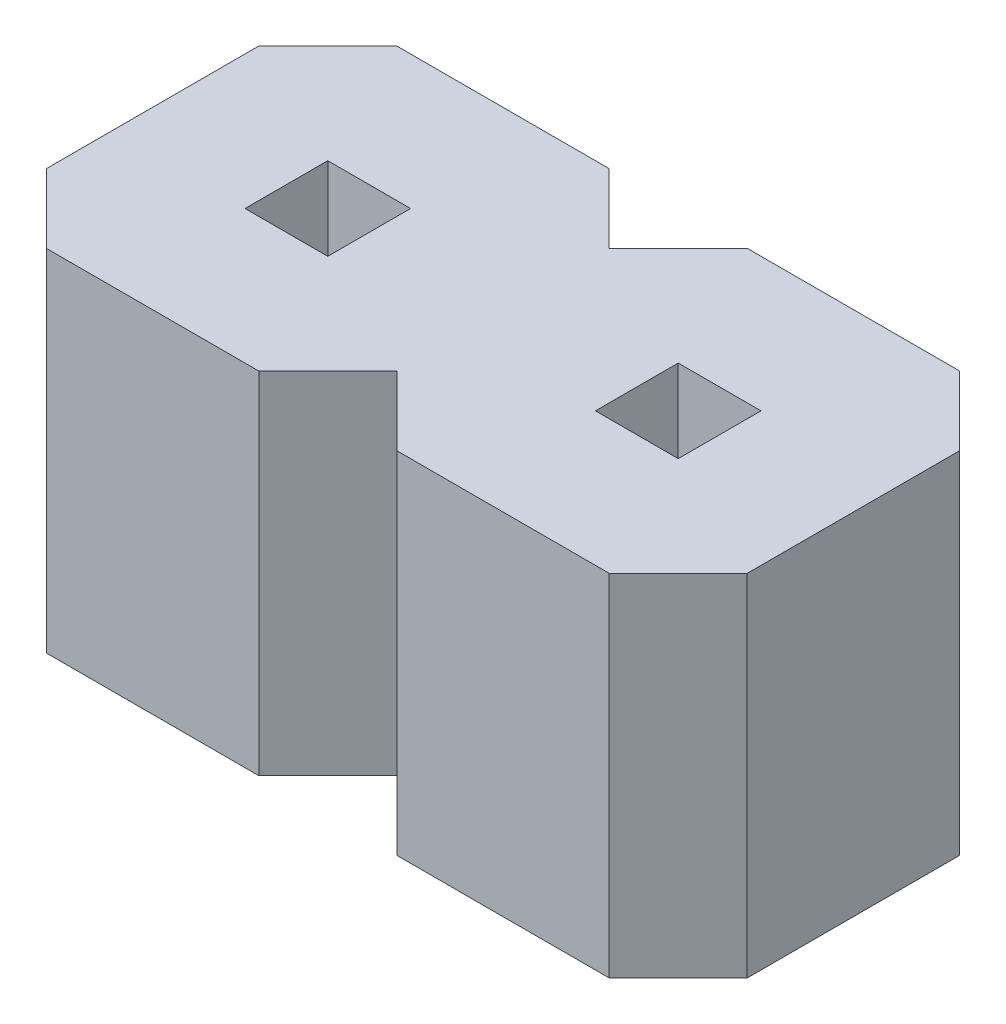
ISO-10303-21;
HEADER;
FILE_DESCRIPTION(('STEP AP214'),'2;1');
FILE_NAME('part.step','',(''),(''),'','','');
FILE_SCHEMA(('AUTOMOTIVE_DESIGN { 1 0 10303 214 1 1 1 1 }'));
ENDSEC;
DATA;
#1=APPLICATION_CONTEXT('core data for automotive mechanical design processes');
#2=APPLICATION_PROTOCOL_DEFINITION('international standard','automotive_design',2000,#1);
#3=PRODUCT_CONTEXT('',#1,'mechanical');
#4=PRODUCT('Part','Part','',(#3));
#5=PRODUCT_RELATED_PRODUCT_CATEGORY('part','',(#4));
#6=PRODUCT_DEFINITION_FORMATION('','',#4);
#7=PRODUCT_DEFINITION_CONTEXT('part definition',#1,'design');
#8=PRODUCT_DEFINITION('design','',#6,#7);
#9=PRODUCT_DEFINITION_SHAPE('','',#8);
#10=(LENGTH_UNIT() NAMED_UNIT(*) SI_UNIT(.MILLI.,.METRE.));
#11=(NAMED_UNIT(*) PLANE_ANGLE_UNIT() SI_UNIT($,.RADIAN.));
#12=(NAMED_UNIT(*) SI_UNIT($,.STERADIAN.) SOLID_ANGLE_UNIT());
#13=UNCERTAINTY_MEASURE_WITH_UNIT(LENGTH_MEASURE(1.E-05),#10,'distance_accuracy_value','');
#14=(GEOMETRIC_REPRESENTATION_CONTEXT(3) GLOBAL_UNCERTAINTY_ASSIGNED_CONTEXT((#13)) GLOBAL_UNIT_ASSIGNED_CONTEXT((#10,
#11,#12)) REPRESENTATION_CONTEXT('',''));
#15=CARTESIAN_POINT('',(0.,0.,0.));
#16=DIRECTION('',(0.,0.,1.));
#17=DIRECTION('',(1.,0.,0.));
#18=AXIS2_PLACEMENT_3D('',#15,#16,#17);
#19=CARTESIAN_POINT('',(0.,2.54,0.));
#20=DIRECTION('',(0.,-1.,0.));
#21=DIRECTION('',(0.,0.,-1.));
#22=AXIS2_PLACEMENT_3D('',#19,#20,#21);
#23=PLANE('',#22);
#24=DIRECTION('',(0.,0.,-1.));
#25=VECTOR('',#24,1.);
#26=CARTESIAN_POINT('',(-3.51,2.54,-0.97));
#27=LINE('',#26,#25);
#28=CARTESIAN_POINT('',(-3.51,2.54,-0.97));
#29=VERTEX_POINT('',#28);
#30=CARTESIAN_POINT('',(-3.51,2.54,-1.57));
#31=VERTEX_POINT('',#30);
#32=EDGE_CURVE('E221',#29,#31,#27,.T.);
#33=ORIENTED_EDGE('',*,*,#32,.F.);
#34=DIRECTION('',(1.,0.,0.));
#35=VECTOR('',#34,1.);
#36=CARTESIAN_POINT('',(-4.11,2.54,-0.97));
#37=LINE('',#36,#35);
#38=CARTESIAN_POINT('',(-4.11,2.54,-0.97));
#39=VERTEX_POINT('',#38);
#40=EDGE_CURVE('E229',#39,#29,#37,.T.);
#41=ORIENTED_EDGE('',*,*,#40,.F.);
#42=DIRECTION('',(0.,0.,1.));
#43=VECTOR('',#42,1.);
#44=CARTESIAN_POINT('',(-4.11,2.54,-0.97));
#45=LINE('',#44,#43);
#46=CARTESIAN_POINT('',(-4.11,2.54,-1.57));
#47=VERTEX_POINT('',#46);
#48=EDGE_CURVE('E226',#47,#39,#45,.T.);
#49=ORIENTED_EDGE('',*,*,#48,.F.);
#50=DIRECTION('',(-1.,0.,0.));
#51=VECTOR('',#50,1.);
#52=CARTESIAN_POINT('',(-4.11,2.54,-1.57));
#53=LINE('',#52,#51);
#54=EDGE_CURVE('E223',#31,#47,#53,.T.);
#55=ORIENTED_EDGE('',*,*,#54,.F.);
#56=EDGE_LOOP('',(#33,#41,#49,#55));
#57=FACE_BOUND('',#56,.T.);
#58=DIRECTION('',(-1.,0.,0.));
#59=VECTOR('',#58,1.);
#60=CARTESIAN_POINT('',(-3.04,2.54,-2.54));
#61=LINE('',#60,#59);
#62=CARTESIAN_POINT('',(-3.04,2.54,-2.54));
#63=VERTEX_POINT('',#62);
#64=CARTESIAN_POINT('',(-4.58,2.54,-2.54));
#65=VERTEX_POINT('',#64);
#66=EDGE_CURVE('E252',#63,#65,#61,.T.);
#67=ORIENTED_EDGE('',*,*,#66,.T.);
#68=DIRECTION('',(-0.707106781186548,0.,0.707106781186548));
#69=VECTOR('',#68,1.);
#70=CARTESIAN_POINT('',(-4.58,2.54,-2.54));
#71=LINE('',#70,#69);
#72=CARTESIAN_POINT('',(-5.08,2.54,-2.04));
#73=VERTEX_POINT('',#72);
#74=EDGE_CURVE('E255',#65,#73,#71,.T.);
#75=ORIENTED_EDGE('',*,*,#74,.T.);
#76=DIRECTION('',(0.,0.,1.));
#77=VECTOR('',#76,1.);
#78=CARTESIAN_POINT('',(-5.08,2.54,-0.499999999999999));
#79=LINE('',#78,#77);
#80=CARTESIAN_POINT('',(-5.08,2.54,-0.499999999999999));
#81=VERTEX_POINT('',#80);
#82=EDGE_CURVE('E258',#73,#81,#79,.T.);
#83=ORIENTED_EDGE('',*,*,#82,.T.);
#84=DIRECTION('',(0.707106781186547,0.,0.707106781186548));
#85=VECTOR('',#84,1.);
#86=CARTESIAN_POINT('',(-4.58,2.54,0.));
#87=LINE('',#86,#85);
#88=CARTESIAN_POINT('',(-4.58,2.54,0.));
#89=VERTEX_POINT('',#88);
#90=EDGE_CURVE('E260',#81,#89,#87,.T.);
#91=ORIENTED_EDGE('',*,*,#90,.T.);
#92=DIRECTION('',(1.,0.,0.));
#93=VECTOR('',#92,1.);
#94=CARTESIAN_POINT('',(-3.04,2.54,0.));
#95=LINE('',#94,#93);
#96=CARTESIAN_POINT('',(-3.04,2.54,0.));
#97=VERTEX_POINT('',#96);
#98=EDGE_CURVE('E262',#89,#97,#95,.T.);
#99=ORIENTED_EDGE('',*,*,#98,.T.);
#100=DIRECTION('',(0.707106781186548,0.,-0.707106781186547));
#101=VECTOR('',#100,1.);
#102=CARTESIAN_POINT('',(-3.04,2.54,0.));
#103=LINE('',#102,#101);
#104=CARTESIAN_POINT('',(-2.54,2.54,-0.499999999999999));
#105=VERTEX_POINT('',#104);
#106=EDGE_CURVE('E264',#97,#105,#103,.T.);
#107=ORIENTED_EDGE('',*,*,#106,.T.);
#108=DIRECTION('',(0.707106781186548,0.,0.707106781186547));
#109=VECTOR('',#108,1.);
#110=CARTESIAN_POINT('',(-2.54,2.54,-0.499999999999999));
#111=LINE('',#110,#109);
#112=CARTESIAN_POINT('',(-2.04,2.54,0.));
#113=VERTEX_POINT('',#112);
#114=EDGE_CURVE('E266',#105,#113,#111,.T.);
#115=ORIENTED_EDGE('',*,*,#114,.T.);
#116=DIRECTION('',(1.,0.,0.));
#117=VECTOR('',#116,1.);
#118=CARTESIAN_POINT('',(-0.5,2.54,0.));
#119=LINE('',#118,#117);
#120=CARTESIAN_POINT('',(-0.5,2.54,0.));
#121=VERTEX_POINT('',#120);
#122=EDGE_CURVE('E268',#113,#121,#119,.T.);
#123=ORIENTED_EDGE('',*,*,#122,.T.);
#124=DIRECTION('',(0.707106781186547,0.,-0.707106781186548));
#125=VECTOR('',#124,1.);
#126=CARTESIAN_POINT('',(0.,2.54,-0.5));
#127=LINE('',#126,#125);
#128=CARTESIAN_POINT('',(0.,2.54,-0.5));
#129=VERTEX_POINT('',#128);
#130=EDGE_CURVE('E270',#121,#129,#127,.T.);
#131=ORIENTED_EDGE('',*,*,#130,.T.);
#132=DIRECTION('',(0.,0.,-1.));
#133=VECTOR('',#132,1.);
#134=CARTESIAN_POINT('',(0.,2.54,-2.04));
#135=LINE('',#134,#133);
#136=CARTESIAN_POINT('',(0.,2.54,-2.04));
#137=VERTEX_POINT('',#136);
#138=EDGE_CURVE('E272',#129,#137,#135,.T.);
#139=ORIENTED_EDGE('',*,*,#138,.T.);
#140=DIRECTION('',(-0.707106781186548,0.,-0.707106781186548));
#141=VECTOR('',#140,1.);
#142=CARTESIAN_POINT('',(0.,2.54,-2.04));
#143=LINE('',#142,#141);
#144=CARTESIAN_POINT('',(-0.5,2.54,-2.54));
#145=VERTEX_POINT('',#144);
#146=EDGE_CURVE('E274',#137,#145,#143,.T.);
#147=ORIENTED_EDGE('',*,*,#146,.T.);
#148=DIRECTION('',(-1.,0.,0.));
#149=VECTOR('',#148,1.);
#150=CARTESIAN_POINT('',(-0.5,2.54,-2.54));
#151=LINE('',#150,#149);
#152=CARTESIAN_POINT('',(-2.04,2.54,-2.54));
#153=VERTEX_POINT('',#152);
#154=EDGE_CURVE('E276',#145,#153,#151,.T.);
#155=ORIENTED_EDGE('',*,*,#154,.T.);
#156=DIRECTION('',(-0.707106781186548,0.,0.707106781186548));
#157=VECTOR('',#156,1.);
#158=CARTESIAN_POINT('',(-2.54,2.54,-2.04));
#159=LINE('',#158,#157);
#160=CARTESIAN_POINT('',(-2.54,2.54,-2.04));
#161=VERTEX_POINT('',#160);
#162=EDGE_CURVE('E278',#153,#161,#159,.T.);
#163=ORIENTED_EDGE('',*,*,#162,.T.);
#164=DIRECTION('',(-0.707106781186548,0.,-0.707106781186547));
#165=VECTOR('',#164,1.);
#166=CARTESIAN_POINT('',(-3.04,2.54,-2.54));
#167=LINE('',#166,#165);
#168=EDGE_CURVE('E280',#161,#63,#167,.T.);
#169=ORIENTED_EDGE('',*,*,#168,.T.);
#170=EDGE_LOOP('',(#67,#75,#83,#91,#99,#107,#115,#123,#131,#139,#147,#155,#163,#169));
#171=FACE_BOUND('',#170,.T.);
#172=DIRECTION('',(0.,0.,-1.));
#173=VECTOR('',#172,1.);
#174=CARTESIAN_POINT('',(-0.97,2.54,-0.97));
#175=LINE('',#174,#173);
#176=CARTESIAN_POINT('',(-0.97,2.54,-0.97));
#177=VERTEX_POINT('',#176);
#178=CARTESIAN_POINT('',(-0.97,2.54,-1.57));
#179=VERTEX_POINT('',#178);
#180=EDGE_CURVE('E185',#177,#179,#175,.T.);
#181=ORIENTED_EDGE('',*,*,#180,.F.);
#182=DIRECTION('',(1.,0.,0.));
#183=VECTOR('',#182,1.);
#184=CARTESIAN_POINT('',(-1.57,2.54,-0.97));
#185=LINE('',#184,#183);
#186=CARTESIAN_POINT('',(-1.57,2.54,-0.97));
#187=VERTEX_POINT('',#186);
#188=EDGE_CURVE('E207',#187,#177,#185,.T.);
#189=ORIENTED_EDGE('',*,*,#188,.F.);
#190=DIRECTION('',(0.,0.,1.));
#191=VECTOR('',#190,1.);
#192=CARTESIAN_POINT('',(-1.57,2.54,-0.97));
#193=LINE('',#192,#191);
#194=CARTESIAN_POINT('',(-1.57,2.54,-1.57));
#195=VERTEX_POINT('',#194);
#196=EDGE_CURVE('E205',#195,#187,#193,.T.);
#197=ORIENTED_EDGE('',*,*,#196,.F.);
#198=DIRECTION('',(-1.,0.,0.));
#199=VECTOR('',#198,1.);
#200=CARTESIAN_POINT('',(-1.57,2.54,-1.57));
#201=LINE('',#200,#199);
#202=EDGE_CURVE('E193',#179,#195,#201,.T.);
#203=ORIENTED_EDGE('',*,*,#202,.F.);
#204=EDGE_LOOP('',(#181,#189,#197,#203));
#205=FACE_BOUND('',#204,.T.);
#206=ADVANCED_FACE('F36',(#57,#171,#205),#23,.F.);
#207=CARTESIAN_POINT('',(0.,0.,0.));
#208=DIRECTION('',(0.,-1.,0.));
#209=DIRECTION('',(0.,0.,-1.));
#210=AXIS2_PLACEMENT_3D('',#207,#208,#209);
#211=PLANE('',#210);
#212=DIRECTION('',(-1.,0.,0.));
#213=VECTOR('',#212,1.);
#214=CARTESIAN_POINT('',(-3.04,0.,-2.54));
#215=LINE('',#214,#213);
#216=CARTESIAN_POINT('',(-3.04,0.,-2.54));
#217=VERTEX_POINT('',#216);
#218=CARTESIAN_POINT('',(-4.58,0.,-2.54));
#219=VERTEX_POINT('',#218);
#220=EDGE_CURVE('E251',#217,#219,#215,.T.);
#221=ORIENTED_EDGE('',*,*,#220,.F.);
#222=DIRECTION('',(-0.707106781186548,0.,-0.707106781186547));
#223=VECTOR('',#222,1.);
#224=CARTESIAN_POINT('',(-3.04,0.,-2.54));
#225=LINE('',#224,#223);
#226=CARTESIAN_POINT('',(-2.54,0.,-2.04));
#227=VERTEX_POINT('',#226);
#228=EDGE_CURVE('E256',#227,#217,#225,.T.);
#229=ORIENTED_EDGE('',*,*,#228,.F.);
#230=DIRECTION('',(-0.707106781186548,0.,0.707106781186548));
#231=VECTOR('',#230,1.);
#232=CARTESIAN_POINT('',(-2.54,0.,-2.04));
#233=LINE('',#232,#231);
#234=CARTESIAN_POINT('',(-2.04,0.,-2.54));
#235=VERTEX_POINT('',#234);
#236=EDGE_CURVE('E307',#235,#227,#233,.T.);
#237=ORIENTED_EDGE('',*,*,#236,.F.);
#238=DIRECTION('',(-1.,0.,0.));
#239=VECTOR('',#238,1.);
#240=CARTESIAN_POINT('',(-0.5,0.,-2.54));
#241=LINE('',#240,#239);
#242=CARTESIAN_POINT('',(-0.5,0.,-2.54));
#243=VERTEX_POINT('',#242);
#244=EDGE_CURVE('E305',#243,#235,#241,.T.);
#245=ORIENTED_EDGE('',*,*,#244,.F.);
#246=DIRECTION('',(-0.707106781186548,0.,-0.707106781186548));
#247=VECTOR('',#246,1.);
#248=CARTESIAN_POINT('',(0.,0.,-2.04));
#249=LINE('',#248,#247);
#250=CARTESIAN_POINT('',(0.,0.,-2.04));
#251=VERTEX_POINT('',#250);
#252=EDGE_CURVE('E303',#251,#243,#249,.T.);
#253=ORIENTED_EDGE('',*,*,#252,.F.);
#254=DIRECTION('',(0.,0.,-1.));
#255=VECTOR('',#254,1.);
#256=CARTESIAN_POINT('',(0.,0.,-2.04));
#257=LINE('',#256,#255);
#258=CARTESIAN_POINT('',(0.,0.,-0.5));
#259=VERTEX_POINT('',#258);
#260=EDGE_CURVE('E301',#259,#251,#257,.T.);
#261=ORIENTED_EDGE('',*,*,#260,.F.);
#262=DIRECTION('',(0.707106781186547,0.,-0.707106781186548));
#263=VECTOR('',#262,1.);
#264=CARTESIAN_POINT('',(0.,0.,-0.5));
#265=LINE('',#264,#263);
#266=CARTESIAN_POINT('',(-0.5,0.,0.));
#267=VERTEX_POINT('',#266);
#268=EDGE_CURVE('E299',#267,#259,#265,.T.);
#269=ORIENTED_EDGE('',*,*,#268,.F.);
#270=DIRECTION('',(1.,0.,0.));
#271=VECTOR('',#270,1.);
#272=CARTESIAN_POINT('',(-0.5,0.,0.));
#273=LINE('',#272,#271);
#274=CARTESIAN_POINT('',(-2.04,0.,0.));
#275=VERTEX_POINT('',#274);
#276=EDGE_CURVE('E297',#275,#267,#273,.T.);
#277=ORIENTED_EDGE('',*,*,#276,.F.);
#278=DIRECTION('',(0.707106781186548,0.,0.707106781186547));
#279=VECTOR('',#278,1.);
#280=CARTESIAN_POINT('',(-2.54,0.,-0.499999999999999));
#281=LINE('',#280,#279);
#282=CARTESIAN_POINT('',(-2.54,0.,-0.499999999999999));
#283=VERTEX_POINT('',#282);
#284=EDGE_CURVE('E295',#283,#275,#281,.T.);
#285=ORIENTED_EDGE('',*,*,#284,.F.);
#286=DIRECTION('',(0.707106781186548,0.,-0.707106781186547));
#287=VECTOR('',#286,1.);
#288=CARTESIAN_POINT('',(-3.04,0.,0.));
#289=LINE('',#288,#287);
#290=CARTESIAN_POINT('',(-3.04,0.,0.));
#291=VERTEX_POINT('',#290);
#292=EDGE_CURVE('E293',#291,#283,#289,.T.);
#293=ORIENTED_EDGE('',*,*,#292,.F.);
#294=DIRECTION('',(1.,0.,0.));
#295=VECTOR('',#294,1.);
#296=CARTESIAN_POINT('',(-3.04,0.,0.));
#297=LINE('',#296,#295);
#298=CARTESIAN_POINT('',(-4.58,0.,0.));
#299=VERTEX_POINT('',#298);
#300=EDGE_CURVE('E291',#299,#291,#297,.T.);
#301=ORIENTED_EDGE('',*,*,#300,.F.);
#302=DIRECTION('',(0.707106781186547,0.,0.707106781186548));
#303=VECTOR('',#302,1.);
#304=CARTESIAN_POINT('',(-4.58,0.,0.));
#305=LINE('',#304,#303);
#306=CARTESIAN_POINT('',(-5.08,0.,-0.499999999999999));
#307=VERTEX_POINT('',#306);
#308=EDGE_CURVE('E289',#307,#299,#305,.T.);
#309=ORIENTED_EDGE('',*,*,#308,.F.);
#310=DIRECTION('',(0.,0.,1.));
#311=VECTOR('',#310,1.);
#312=CARTESIAN_POINT('',(-5.08,0.,-0.499999999999999));
#313=LINE('',#312,#311);
#314=CARTESIAN_POINT('',(-5.08,0.,-2.04));
#315=VERTEX_POINT('',#314);
#316=EDGE_CURVE('E287',#315,#307,#313,.T.);
#317=ORIENTED_EDGE('',*,*,#316,.F.);
#318=DIRECTION('',(-0.707106781186548,0.,0.707106781186548));
#319=VECTOR('',#318,1.);
#320=CARTESIAN_POINT('',(-4.58,0.,-2.54));
#321=LINE('',#320,#319);
#322=EDGE_CURVE('E285',#219,#315,#321,.T.);
#323=ORIENTED_EDGE('',*,*,#322,.F.);
#324=EDGE_LOOP('',(#221,#229,#237,#245,#253,#261,#269,#277,#285,#293,#301,#309,#317,#323));
#325=FACE_BOUND('',#324,.T.);
#326=DIRECTION('',(1.,0.,0.));
#327=VECTOR('',#326,1.);
#328=CARTESIAN_POINT('',(-4.11,0.,-0.97));
#329=LINE('',#328,#327);
#330=CARTESIAN_POINT('',(-4.11,0.,-0.97));
#331=VERTEX_POINT('',#330);
#332=CARTESIAN_POINT('',(-3.51,0.,-0.97));
#333=VERTEX_POINT('',#332);
#334=EDGE_CURVE('E224',#331,#333,#329,.T.);
#335=ORIENTED_EDGE('',*,*,#334,.T.);
#336=DIRECTION('',(0.,0.,-1.));
#337=VECTOR('',#336,1.);
#338=CARTESIAN_POINT('',(-3.51,0.,-0.97));
#339=LINE('',#338,#337);
#340=CARTESIAN_POINT('',(-3.51,0.,-1.57));
#341=VERTEX_POINT('',#340);
#342=EDGE_CURVE('E201',#333,#341,#339,.T.);
#343=ORIENTED_EDGE('',*,*,#342,.T.);
#344=DIRECTION('',(-1.,0.,0.));
#345=VECTOR('',#344,1.);
#346=CARTESIAN_POINT('',(-4.11,0.,-1.57));
#347=LINE('',#346,#345);
#348=CARTESIAN_POINT('',(-4.11,0.,-1.57));
#349=VERTEX_POINT('',#348);
#350=EDGE_CURVE('E234',#341,#349,#347,.T.);
#351=ORIENTED_EDGE('',*,*,#350,.T.);
#352=DIRECTION('',(0.,0.,1.));
#353=VECTOR('',#352,1.);
#354=CARTESIAN_POINT('',(-4.11,0.,-0.97));
#355=LINE('',#354,#353);
#356=EDGE_CURVE('E237',#349,#331,#355,.T.);
#357=ORIENTED_EDGE('',*,*,#356,.T.);
#358=EDGE_LOOP('',(#335,#343,#351,#357));
#359=FACE_BOUND('',#358,.T.);
#360=DIRECTION('',(1.,0.,0.));
#361=VECTOR('',#360,1.);
#362=CARTESIAN_POINT('',(-1.57,0.,-0.97));
#363=LINE('',#362,#361);
#364=CARTESIAN_POINT('',(-1.57,0.,-0.97));
#365=VERTEX_POINT('',#364);
#366=CARTESIAN_POINT('',(-0.97,0.,-0.97));
#367=VERTEX_POINT('',#366);
#368=EDGE_CURVE('E194',#365,#367,#363,.T.);
#369=ORIENTED_EDGE('',*,*,#368,.T.);
#370=DIRECTION('',(0.,0.,-1.));
#371=VECTOR('',#370,1.);
#372=CARTESIAN_POINT('',(-0.97,0.,-0.97));
#373=LINE('',#372,#371);
#374=CARTESIAN_POINT('',(-0.97,0.,-1.57));
#375=VERTEX_POINT('',#374);
#376=EDGE_CURVE('E59',#367,#375,#373,.T.);
#377=ORIENTED_EDGE('',*,*,#376,.T.);
#378=DIRECTION('',(-1.,0.,0.));
#379=VECTOR('',#378,1.);
#380=CARTESIAN_POINT('',(-1.57,0.,-1.57));
#381=LINE('',#380,#379);
#382=CARTESIAN_POINT('',(-1.57,0.,-1.57));
#383=VERTEX_POINT('',#382);
#384=EDGE_CURVE('E200',#375,#383,#381,.T.);
#385=ORIENTED_EDGE('',*,*,#384,.T.);
#386=DIRECTION('',(0.,0.,1.));
#387=VECTOR('',#386,1.);
#388=CARTESIAN_POINT('',(-1.57,0.,-0.97));
#389=LINE('',#388,#387);
#390=EDGE_CURVE('E213',#383,#365,#389,.T.);
#391=ORIENTED_EDGE('',*,*,#390,.T.);
#392=EDGE_LOOP('',(#369,#377,#385,#391));
#393=FACE_BOUND('',#392,.T.);
#394=ADVANCED_FACE('F355',(#325,#359,#393),#211,.T.);
#395=CARTESIAN_POINT('',(-3.04,2.54,-2.54));
#396=DIRECTION('',(0.,0.,1.));
#397=DIRECTION('',(1.,0.,0.));
#398=AXIS2_PLACEMENT_3D('',#395,#396,#397);
#399=PLANE('',#398);
#400=ORIENTED_EDGE('',*,*,#220,.T.);
#401=DIRECTION('',(0.,-1.,0.));
#402=VECTOR('',#401,1.);
#403=CARTESIAN_POINT('',(-4.58,2.54,-2.54));
#404=LINE('',#403,#402);
#405=EDGE_CURVE('E11',#65,#219,#404,.T.);
#406=ORIENTED_EDGE('',*,*,#405,.F.);
#407=ORIENTED_EDGE('',*,*,#66,.F.);
#408=DIRECTION('',(0.,-1.,0.));
#409=VECTOR('',#408,1.);
#410=CARTESIAN_POINT('',(-3.04,2.54,-2.54));
#411=LINE('',#410,#409);
#412=EDGE_CURVE('E282',#63,#217,#411,.T.);
#413=ORIENTED_EDGE('',*,*,#412,.T.);
#414=EDGE_LOOP('',(#400,#406,#407,#413));
#415=FACE_BOUND('',#414,.T.);
#416=ADVANCED_FACE('F38',(#415),#399,.F.);
#417=CARTESIAN_POINT('',(-4.58,2.54,-2.54));
#418=DIRECTION('',(0.707106781186548,0.,0.707106781186548));
#419=DIRECTION('',(0.707106781186548,0.,-0.707106781186548));
#420=AXIS2_PLACEMENT_3D('',#417,#418,#419);
#421=PLANE('',#420);
#422=ORIENTED_EDGE('',*,*,#322,.T.);
#423=DIRECTION('',(0.,-1.,0.));
#424=VECTOR('',#423,1.);
#425=CARTESIAN_POINT('',(-5.08,2.54,-2.04));
#426=LINE('',#425,#424);
#427=EDGE_CURVE('E44',#73,#315,#426,.T.);
#428=ORIENTED_EDGE('',*,*,#427,.F.);
#429=ORIENTED_EDGE('',*,*,#74,.F.);
#430=ORIENTED_EDGE('',*,*,#405,.T.);
#431=EDGE_LOOP('',(#422,#428,#429,#430));
#432=FACE_BOUND('',#431,.T.);
#433=ADVANCED_FACE('F372',(#432),#421,.F.);
#434=CARTESIAN_POINT('',(-5.08,2.54,-0.499999999999999));
#435=DIRECTION('',(1.,0.,0.));
#436=DIRECTION('',(0.,0.,-1.));
#437=AXIS2_PLACEMENT_3D('',#434,#435,#436);
#438=PLANE('',#437);
#439=ORIENTED_EDGE('',*,*,#316,.T.);
#440=DIRECTION('',(0.,-1.,0.));
#441=VECTOR('',#440,1.);
#442=CARTESIAN_POINT('',(-5.08,2.54,-0.499999999999999));
#443=LINE('',#442,#441);
#444=EDGE_CURVE('E342',#81,#307,#443,.T.);
#445=ORIENTED_EDGE('',*,*,#444,.F.);
#446=ORIENTED_EDGE('',*,*,#82,.F.);
#447=ORIENTED_EDGE('',*,*,#427,.T.);
#448=EDGE_LOOP('',(#439,#445,#446,#447));
#449=FACE_BOUND('',#448,.T.);
#450=ADVANCED_FACE('F349',(#449),#438,.F.);
#451=CARTESIAN_POINT('',(-4.58,2.54,0.));
#452=DIRECTION('',(0.707106781186548,0.,-0.707106781186547));
#453=DIRECTION('',(-0.707106781186547,0.,-0.707106781186548));
#454=AXIS2_PLACEMENT_3D('',#451,#452,#453);
#455=PLANE('',#454);
#456=ORIENTED_EDGE('',*,*,#308,.T.);
#457=DIRECTION('',(0.,-1.,0.));
#458=VECTOR('',#457,1.);
#459=CARTESIAN_POINT('',(-4.58,2.54,0.));
#460=LINE('',#459,#458);
#461=EDGE_CURVE('E339',#89,#299,#460,.T.);
#462=ORIENTED_EDGE('',*,*,#461,.F.);
#463=ORIENTED_EDGE('',*,*,#90,.F.);
#464=ORIENTED_EDGE('',*,*,#444,.T.);
#465=EDGE_LOOP('',(#456,#462,#463,#464));
#466=FACE_BOUND('',#465,.T.);
#467=ADVANCED_FACE('F361',(#466),#455,.F.);
#468=CARTESIAN_POINT('',(-3.04,2.54,0.));
#469=DIRECTION('',(0.,0.,-1.));
#470=DIRECTION('',(-1.,0.,0.));
#471=AXIS2_PLACEMENT_3D('',#468,#469,#470);
#472=PLANE('',#471);
#473=ORIENTED_EDGE('',*,*,#300,.T.);
#474=DIRECTION('',(0.,-1.,0.));
#475=VECTOR('',#474,1.);
#476=CARTESIAN_POINT('',(-3.04,2.54,0.));
#477=LINE('',#476,#475);
#478=EDGE_CURVE('E336',#97,#291,#477,.T.);
#479=ORIENTED_EDGE('',*,*,#478,.F.);
#480=ORIENTED_EDGE('',*,*,#98,.F.);
#481=ORIENTED_EDGE('',*,*,#461,.T.);
#482=EDGE_LOOP('',(#473,#479,#480,#481));
#483=FACE_BOUND('',#482,.T.);
#484=ADVANCED_FACE('F365',(#483),#472,.F.);
#485=CARTESIAN_POINT('',(-3.04,2.54,0.));
#486=DIRECTION('',(-0.707106781186547,0.,-0.707106781186548));
#487=DIRECTION('',(-0.707106781186548,0.,0.707106781186547));
#488=AXIS2_PLACEMENT_3D('',#485,#486,#487);
#489=PLANE('',#488);
#490=ORIENTED_EDGE('',*,*,#292,.T.);
#491=DIRECTION('',(0.,-1.,0.));
#492=VECTOR('',#491,1.);
#493=CARTESIAN_POINT('',(-2.54,2.54,-0.499999999999999));
#494=LINE('',#493,#492);
#495=EDGE_CURVE('E333',#105,#283,#494,.T.);
#496=ORIENTED_EDGE('',*,*,#495,.F.);
#497=ORIENTED_EDGE('',*,*,#106,.F.);
#498=ORIENTED_EDGE('',*,*,#478,.T.);
#499=EDGE_LOOP('',(#490,#496,#497,#498));
#500=FACE_BOUND('',#499,.T.);
#501=ADVANCED_FACE('F415',(#500),#489,.F.);
#502=CARTESIAN_POINT('',(-2.54,2.54,-0.499999999999999));
#503=DIRECTION('',(0.707106781186547,0.,-0.707106781186548));
#504=DIRECTION('',(-0.707106781186548,0.,-0.707106781186547));
#505=AXIS2_PLACEMENT_3D('',#502,#503,#504);
#506=PLANE('',#505);
#507=ORIENTED_EDGE('',*,*,#284,.T.);
#508=DIRECTION('',(0.,-1.,0.));
#509=VECTOR('',#508,1.);
#510=CARTESIAN_POINT('',(-2.04,2.54,0.));
#511=LINE('',#510,#509);
#512=EDGE_CURVE('E330',#113,#275,#511,.T.);
#513=ORIENTED_EDGE('',*,*,#512,.F.);
#514=ORIENTED_EDGE('',*,*,#114,.F.);
#515=ORIENTED_EDGE('',*,*,#495,.T.);
#516=EDGE_LOOP('',(#507,#513,#514,#515));
#517=FACE_BOUND('',#516,.T.);
#518=ADVANCED_FACE('F413',(#517),#506,.F.);
#519=CARTESIAN_POINT('',(-0.5,2.54,0.));
#520=DIRECTION('',(0.,0.,-1.));
#521=DIRECTION('',(-1.,0.,0.));
#522=AXIS2_PLACEMENT_3D('',#519,#520,#521);
#523=PLANE('',#522);
#524=ORIENTED_EDGE('',*,*,#276,.T.);
#525=DIRECTION('',(0.,-1.,0.));
#526=VECTOR('',#525,1.);
#527=CARTESIAN_POINT('',(-0.5,2.54,0.));
#528=LINE('',#527,#526);
#529=EDGE_CURVE('E327',#121,#267,#528,.T.);
#530=ORIENTED_EDGE('',*,*,#529,.F.);
#531=ORIENTED_EDGE('',*,*,#122,.F.);
#532=ORIENTED_EDGE('',*,*,#512,.T.);
#533=EDGE_LOOP('',(#524,#530,#531,#532));
#534=FACE_BOUND('',#533,.T.);
#535=ADVANCED_FACE('F408',(#534),#523,.F.);
#536=CARTESIAN_POINT('',(0.,2.54,-0.5));
#537=DIRECTION('',(-0.707106781186548,0.,-0.707106781186547));
#538=DIRECTION('',(-0.707106781186547,0.,0.707106781186548));
#539=AXIS2_PLACEMENT_3D('',#536,#537,#538);
#540=PLANE('',#539);
#541=ORIENTED_EDGE('',*,*,#268,.T.);
#542=DIRECTION('',(0.,-1.,0.));
#543=VECTOR('',#542,1.);
#544=CARTESIAN_POINT('',(0.,2.54,-0.5));
#545=LINE('',#544,#543);
#546=EDGE_CURVE('E324',#129,#259,#545,.T.);
#547=ORIENTED_EDGE('',*,*,#546,.F.);
#548=ORIENTED_EDGE('',*,*,#130,.F.);
#549=ORIENTED_EDGE('',*,*,#529,.T.);
#550=EDGE_LOOP('',(#541,#547,#548,#549));
#551=FACE_BOUND('',#550,.T.);
#552=ADVANCED_FACE('F403',(#551),#540,.F.);
#553=CARTESIAN_POINT('',(0.,2.54,-2.04));
#554=DIRECTION('',(-1.,0.,0.));
#555=DIRECTION('',(0.,0.,1.));
#556=AXIS2_PLACEMENT_3D('',#553,#554,#555);
#557=PLANE('',#556);
#558=ORIENTED_EDGE('',*,*,#260,.T.);
#559=DIRECTION('',(0.,-1.,0.));
#560=VECTOR('',#559,1.);
#561=CARTESIAN_POINT('',(0.,2.54,-2.04));
#562=LINE('',#561,#560);
#563=EDGE_CURVE('E321',#137,#251,#562,.T.);
#564=ORIENTED_EDGE('',*,*,#563,.F.);
#565=ORIENTED_EDGE('',*,*,#138,.F.);
#566=ORIENTED_EDGE('',*,*,#546,.T.);
#567=EDGE_LOOP('',(#558,#564,#565,#566));
#568=FACE_BOUND('',#567,.T.);
#569=ADVANCED_FACE('F399',(#568),#557,.F.);
#570=CARTESIAN_POINT('',(0.,2.54,-2.04));
#571=DIRECTION('',(-0.707106781186548,0.,0.707106781186548));
#572=DIRECTION('',(0.707106781186548,0.,0.707106781186548));
#573=AXIS2_PLACEMENT_3D('',#570,#571,#572);
#574=PLANE('',#573);
#575=ORIENTED_EDGE('',*,*,#252,.T.);
#576=DIRECTION('',(0.,-1.,0.));
#577=VECTOR('',#576,1.);
#578=CARTESIAN_POINT('',(-0.5,2.54,-2.54));
#579=LINE('',#578,#577);
#580=EDGE_CURVE('E318',#145,#243,#579,.T.);
#581=ORIENTED_EDGE('',*,*,#580,.F.);
#582=ORIENTED_EDGE('',*,*,#146,.F.);
#583=ORIENTED_EDGE('',*,*,#563,.T.);
#584=EDGE_LOOP('',(#575,#581,#582,#583));
#585=FACE_BOUND('',#584,.T.);
#586=ADVANCED_FACE('F394',(#585),#574,.F.);
#587=CARTESIAN_POINT('',(-0.5,2.54,-2.54));
#588=DIRECTION('',(0.,0.,1.));
#589=DIRECTION('',(1.,0.,0.));
#590=AXIS2_PLACEMENT_3D('',#587,#588,#589);
#591=PLANE('',#590);
#592=ORIENTED_EDGE('',*,*,#244,.T.);
#593=DIRECTION('',(0.,-1.,0.));
#594=VECTOR('',#593,1.);
#595=CARTESIAN_POINT('',(-2.04,2.54,-2.54));
#596=LINE('',#595,#594);
#597=EDGE_CURVE('E315',#153,#235,#596,.T.);
#598=ORIENTED_EDGE('',*,*,#597,.F.);
#599=ORIENTED_EDGE('',*,*,#154,.F.);
#600=ORIENTED_EDGE('',*,*,#580,.T.);
#601=EDGE_LOOP('',(#592,#598,#599,#600));
#602=FACE_BOUND('',#601,.T.);
#603=ADVANCED_FACE('F388',(#602),#591,.F.);
#604=CARTESIAN_POINT('',(-2.54,2.54,-2.04));
#605=DIRECTION('',(0.707106781186548,0.,0.707106781186548));
#606=DIRECTION('',(0.707106781186548,0.,-0.707106781186548));
#607=AXIS2_PLACEMENT_3D('',#604,#605,#606);
#608=PLANE('',#607);
#609=ORIENTED_EDGE('',*,*,#236,.T.);
#610=DIRECTION('',(0.,-1.,0.));
#611=VECTOR('',#610,1.);
#612=CARTESIAN_POINT('',(-2.54,2.54,-2.04));
#613=LINE('',#612,#611);
#614=EDGE_CURVE('E312',#161,#227,#613,.T.);
#615=ORIENTED_EDGE('',*,*,#614,.F.);
#616=ORIENTED_EDGE('',*,*,#162,.F.);
#617=ORIENTED_EDGE('',*,*,#597,.T.);
#618=EDGE_LOOP('',(#609,#615,#616,#617));
#619=FACE_BOUND('',#618,.T.);
#620=ADVANCED_FACE('F384',(#619),#608,.F.);
#621=CARTESIAN_POINT('',(-3.04,2.54,-2.54));
#622=DIRECTION('',(-0.707106781186547,0.,0.707106781186548));
#623=DIRECTION('',(0.707106781186548,0.,0.707106781186547));
#624=AXIS2_PLACEMENT_3D('',#621,#622,#623);
#625=PLANE('',#624);
#626=ORIENTED_EDGE('',*,*,#228,.T.);
#627=ORIENTED_EDGE('',*,*,#412,.F.);
#628=ORIENTED_EDGE('',*,*,#168,.F.);
#629=ORIENTED_EDGE('',*,*,#614,.T.);
#630=EDGE_LOOP('',(#626,#627,#628,#629));
#631=FACE_BOUND('',#630,.T.);
#632=ADVANCED_FACE('F379',(#631),#625,.F.);
#633=CARTESIAN_POINT('',(-3.51,2.54,-0.97));
#634=DIRECTION('',(-1.,0.,0.));
#635=DIRECTION('',(0.,0.,1.));
#636=AXIS2_PLACEMENT_3D('',#633,#634,#635);
#637=PLANE('',#636);
#638=ORIENTED_EDGE('',*,*,#342,.F.);
#639=DIRECTION('',(0.,-1.,0.));
#640=VECTOR('',#639,1.);
#641=CARTESIAN_POINT('',(-3.51,2.54,-0.97));
#642=LINE('',#641,#640);
#643=EDGE_CURVE('E231',#29,#333,#642,.T.);
#644=ORIENTED_EDGE('',*,*,#643,.F.);
#645=ORIENTED_EDGE('',*,*,#32,.T.);
#646=DIRECTION('',(0.,-1.,0.));
#647=VECTOR('',#646,1.);
#648=CARTESIAN_POINT('',(-3.51,2.54,-1.57));
#649=LINE('',#648,#647);
#650=EDGE_CURVE('E248',#31,#341,#649,.T.);
#651=ORIENTED_EDGE('',*,*,#650,.T.);
#652=EDGE_LOOP('',(#638,#644,#645,#651));
#653=FACE_BOUND('',#652,.T.);
#654=ADVANCED_FACE('F433',(#653),#637,.T.);
#655=CARTESIAN_POINT('',(-4.11,2.54,-1.57));
#656=DIRECTION('',(0.,0.,1.));
#657=DIRECTION('',(1.,0.,0.));
#658=AXIS2_PLACEMENT_3D('',#655,#656,#657);
#659=PLANE('',#658);
#660=ORIENTED_EDGE('',*,*,#350,.F.);
#661=ORIENTED_EDGE('',*,*,#650,.F.);
#662=ORIENTED_EDGE('',*,*,#54,.T.);
#663=DIRECTION('',(0.,-1.,0.));
#664=VECTOR('',#663,1.);
#665=CARTESIAN_POINT('',(-4.11,2.54,-1.57));
#666=LINE('',#665,#664);
#667=EDGE_CURVE('E246',#47,#349,#666,.T.);
#668=ORIENTED_EDGE('',*,*,#667,.T.);
#669=EDGE_LOOP('',(#660,#661,#662,#668));
#670=FACE_BOUND('',#669,.T.);
#671=ADVANCED_FACE('F483',(#670),#659,.T.);
#672=CARTESIAN_POINT('',(-4.11,2.54,-0.97));
#673=DIRECTION('',(1.,0.,0.));
#674=DIRECTION('',(0.,0.,-1.));
#675=AXIS2_PLACEMENT_3D('',#672,#673,#674);
#676=PLANE('',#675);
#677=ORIENTED_EDGE('',*,*,#356,.F.);
#678=ORIENTED_EDGE('',*,*,#667,.F.);
#679=ORIENTED_EDGE('',*,*,#48,.T.);
#680=DIRECTION('',(0.,-1.,0.));
#681=VECTOR('',#680,1.);
#682=CARTESIAN_POINT('',(-4.11,2.54,-0.97));
#683=LINE('',#682,#681);
#684=EDGE_CURVE('E244',#39,#331,#683,.T.);
#685=ORIENTED_EDGE('',*,*,#684,.T.);
#686=EDGE_LOOP('',(#677,#678,#679,#685));
#687=FACE_BOUND('',#686,.T.);
#688=ADVANCED_FACE('F490',(#687),#676,.T.);
#689=CARTESIAN_POINT('',(-4.11,2.54,-0.97));
#690=DIRECTION('',(0.,0.,-1.));
#691=DIRECTION('',(-1.,0.,0.));
#692=AXIS2_PLACEMENT_3D('',#689,#690,#691);
#693=PLANE('',#692);
#694=ORIENTED_EDGE('',*,*,#334,.F.);
#695=ORIENTED_EDGE('',*,*,#684,.F.);
#696=ORIENTED_EDGE('',*,*,#40,.T.);
#697=ORIENTED_EDGE('',*,*,#643,.T.);
#698=EDGE_LOOP('',(#694,#695,#696,#697));
#699=FACE_BOUND('',#698,.T.);
#700=ADVANCED_FACE('F497',(#699),#693,.T.);
#701=CARTESIAN_POINT('',(-0.97,2.54,-0.97));
#702=DIRECTION('',(-1.,0.,0.));
#703=DIRECTION('',(0.,0.,1.));
#704=AXIS2_PLACEMENT_3D('',#701,#702,#703);
#705=PLANE('',#704);
#706=ORIENTED_EDGE('',*,*,#376,.F.);
#707=DIRECTION('',(0.,-1.,0.));
#708=VECTOR('',#707,1.);
#709=CARTESIAN_POINT('',(-0.97,2.54,-0.97));
#710=LINE('',#709,#708);
#711=EDGE_CURVE('E189',#177,#367,#710,.T.);
#712=ORIENTED_EDGE('',*,*,#711,.F.);
#713=ORIENTED_EDGE('',*,*,#180,.T.);
#714=DIRECTION('',(0.,-1.,0.));
#715=VECTOR('',#714,1.);
#716=CARTESIAN_POINT('',(-0.97,2.54,-1.57));
#717=LINE('',#716,#715);
#718=EDGE_CURVE('E188',#179,#375,#717,.T.);
#719=ORIENTED_EDGE('',*,*,#718,.T.);
#720=EDGE_LOOP('',(#706,#712,#713,#719));
#721=FACE_BOUND('',#720,.T.);
#722=ADVANCED_FACE('F187',(#721),#705,.T.);
#723=CARTESIAN_POINT('',(-1.57,2.54,-1.57));
#724=DIRECTION('',(0.,0.,1.));
#725=DIRECTION('',(1.,0.,0.));
#726=AXIS2_PLACEMENT_3D('',#723,#724,#725);
#727=PLANE('',#726);
#728=ORIENTED_EDGE('',*,*,#384,.F.);
#729=ORIENTED_EDGE('',*,*,#718,.F.);
#730=ORIENTED_EDGE('',*,*,#202,.T.);
#731=DIRECTION('',(0.,-1.,0.));
#732=VECTOR('',#731,1.);
#733=CARTESIAN_POINT('',(-1.57,2.54,-1.57));
#734=LINE('',#733,#732);
#735=EDGE_CURVE('E202',#195,#383,#734,.T.);
#736=ORIENTED_EDGE('',*,*,#735,.T.);
#737=EDGE_LOOP('',(#728,#729,#730,#736));
#738=FACE_BOUND('',#737,.T.);
#739=ADVANCED_FACE('F197',(#738),#727,.T.);
#740=CARTESIAN_POINT('',(-1.57,2.54,-0.97));
#741=DIRECTION('',(1.,0.,0.));
#742=DIRECTION('',(0.,0.,-1.));
#743=AXIS2_PLACEMENT_3D('',#740,#741,#742);
#744=PLANE('',#743);
#745=ORIENTED_EDGE('',*,*,#390,.F.);
#746=ORIENTED_EDGE('',*,*,#735,.F.);
#747=ORIENTED_EDGE('',*,*,#196,.T.);
#748=DIRECTION('',(0.,-1.,0.));
#749=VECTOR('',#748,1.);
#750=CARTESIAN_POINT('',(-1.57,2.54,-0.97));
#751=LINE('',#750,#749);
#752=EDGE_CURVE('E51',#187,#365,#751,.T.);
#753=ORIENTED_EDGE('',*,*,#752,.T.);
#754=EDGE_LOOP('',(#745,#746,#747,#753));
#755=FACE_BOUND('',#754,.T.);
#756=ADVANCED_FACE('F518',(#755),#744,.T.);
#757=CARTESIAN_POINT('',(-1.57,2.54,-0.97));
#758=DIRECTION('',(0.,0.,-1.));
#759=DIRECTION('',(-1.,0.,0.));
#760=AXIS2_PLACEMENT_3D('',#757,#758,#759);
#761=PLANE('',#760);
#762=ORIENTED_EDGE('',*,*,#368,.F.);
#763=ORIENTED_EDGE('',*,*,#752,.F.);
#764=ORIENTED_EDGE('',*,*,#188,.T.);
#765=ORIENTED_EDGE('',*,*,#711,.T.);
#766=EDGE_LOOP('',(#762,#763,#764,#765));
#767=FACE_BOUND('',#766,.T.);
#768=ADVANCED_FACE('F525',(#767),#761,.T.);
#769=CLOSED_SHELL('',(#206,#394,#416,#433,#450,#467,#484,#501,#518,#535,#552,#569,#586,#603,
#620,#632,#654,#671,#688,#700,#722,#739,#756,#768));
#770=MANIFOLD_SOLID_BREP('B2',#769);
#771=ADVANCED_BREP_SHAPE_REPRESENTATION('',(#18,#770),#14);
#772=SHAPE_DEFINITION_REPRESENTATION(#9,#771);
ENDSEC;
END-ISO-10303-21;
